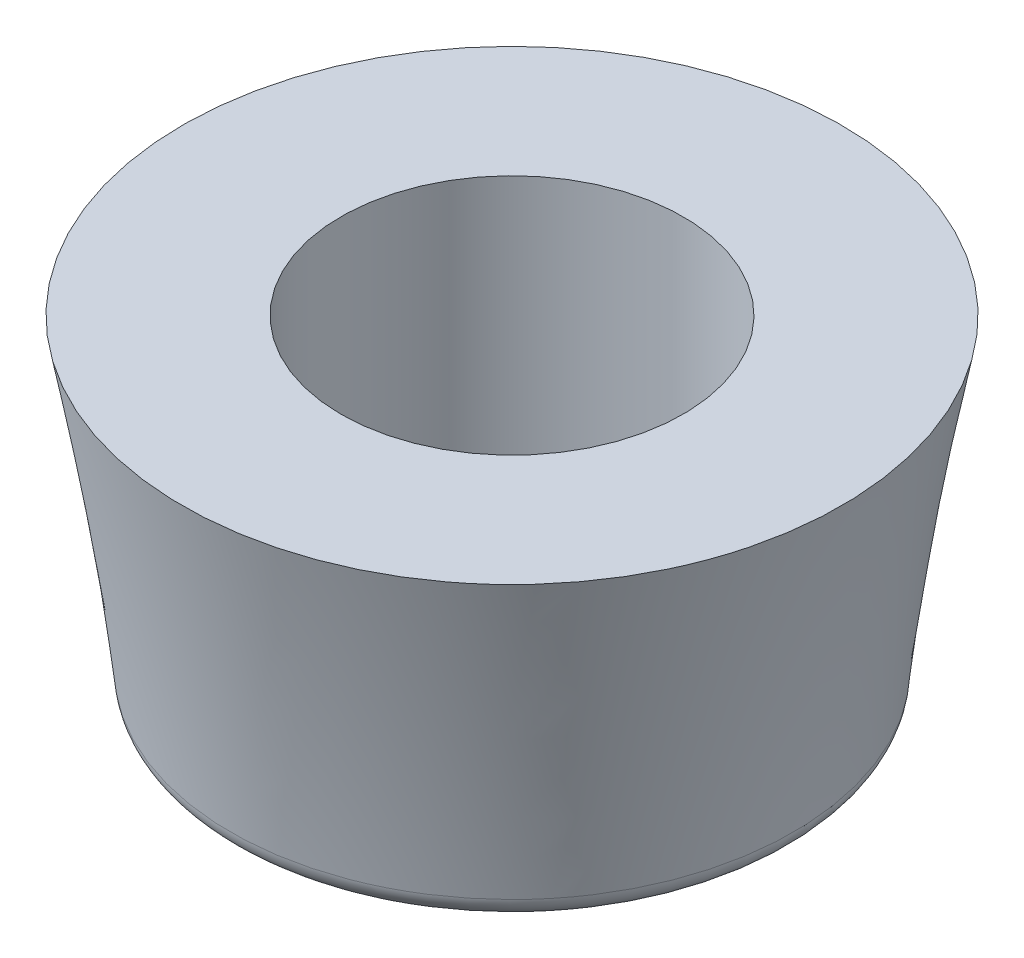
ISO-10303-21;
HEADER;
FILE_DESCRIPTION(('STEP AP214'),'2;1');
FILE_NAME('part.step','',(''),(''),'','','');
FILE_SCHEMA(('AUTOMOTIVE_DESIGN { 1 0 10303 214 1 1 1 1 }'));
ENDSEC;
DATA;
#1=APPLICATION_CONTEXT('core data for automotive mechanical design processes');
#2=APPLICATION_PROTOCOL_DEFINITION('international standard','automotive_design',2000,#1);
#3=PRODUCT_CONTEXT('',#1,'mechanical');
#4=PRODUCT('Part','Part','',(#3));
#5=PRODUCT_RELATED_PRODUCT_CATEGORY('part','',(#4));
#6=PRODUCT_DEFINITION_FORMATION('','',#4);
#7=PRODUCT_DEFINITION_CONTEXT('part definition',#1,'design');
#8=PRODUCT_DEFINITION('design','',#6,#7);
#9=PRODUCT_DEFINITION_SHAPE('','',#8);
#10=(LENGTH_UNIT() NAMED_UNIT(*) SI_UNIT(.MILLI.,.METRE.));
#11=(NAMED_UNIT(*) PLANE_ANGLE_UNIT() SI_UNIT($,.RADIAN.));
#12=(NAMED_UNIT(*) SI_UNIT($,.STERADIAN.) SOLID_ANGLE_UNIT());
#13=UNCERTAINTY_MEASURE_WITH_UNIT(LENGTH_MEASURE(1.E-05),#10,'distance_accuracy_value','');
#14=(GEOMETRIC_REPRESENTATION_CONTEXT(3) GLOBAL_UNCERTAINTY_ASSIGNED_CONTEXT((#13)) GLOBAL_UNIT_ASSIGNED_CONTEXT((#10,
#11,#12)) REPRESENTATION_CONTEXT('',''));
#15=CARTESIAN_POINT('',(0.,0.,0.));
#16=DIRECTION('',(0.,0.,1.));
#17=DIRECTION('',(1.,0.,0.));
#18=AXIS2_PLACEMENT_3D('',#15,#16,#17);
#19=CARTESIAN_POINT('',(0.,0.,0.));
#20=DIRECTION('',(0.,1.,0.));
#21=DIRECTION('',(0.,0.,1.));
#22=AXIS2_PLACEMENT_3D('',#19,#20,#21);
#23=PLANE('',#22);
#24=CARTESIAN_POINT('',(0.,0.,0.));
#25=DIRECTION('',(0.,1.,0.));
#26=DIRECTION('',(0.,0.,1.));
#27=AXIS2_PLACEMENT_3D('',#24,#25,#26);
#28=CIRCLE('',#27,7.25);
#29=CARTESIAN_POINT('',(0.,0.,7.25));
#30=VERTEX_POINT('',#29);
#31=EDGE_CURVE('E44',#30,#30,#28,.T.);
#32=ORIENTED_EDGE('',*,*,#31,.T.);
#33=EDGE_LOOP('',(#32));
#34=FACE_BOUND('',#33,.T.);
#35=CARTESIAN_POINT('',(0.,0.,0.));
#36=DIRECTION('',(0.,1.,0.));
#37=DIRECTION('',(0.,0.,1.));
#38=AXIS2_PLACEMENT_3D('',#35,#36,#37);
#39=CIRCLE('',#38,10.0982468244462);
#40=CARTESIAN_POINT('',(0.,0.,10.0982468244462));
#41=VERTEX_POINT('',#40);
#42=EDGE_CURVE('E48',#41,#41,#39,.F.);
#43=ORIENTED_EDGE('',*,*,#42,.T.);
#44=EDGE_LOOP('',(#43));
#45=FACE_BOUND('',#44,.T.);
#46=ADVANCED_FACE('F36',(#34,#45),#23,.F.);
#47=CARTESIAN_POINT('',(0.,13.,0.));
#48=DIRECTION('',(0.,1.,0.));
#49=DIRECTION('',(0.,0.,1.));
#50=AXIS2_PLACEMENT_3D('',#47,#48,#49);
#51=PLANE('',#50);
#52=CARTESIAN_POINT('',(0.,13.,0.));
#53=DIRECTION('',(0.,1.,0.));
#54=DIRECTION('',(0.,0.,1.));
#55=AXIS2_PLACEMENT_3D('',#52,#53,#54);
#56=CIRCLE('',#55,6.75);
#57=CARTESIAN_POINT('',(0.,13.,6.75));
#58=VERTEX_POINT('',#57);
#59=EDGE_CURVE('E62',#58,#58,#56,.T.);
#60=ORIENTED_EDGE('',*,*,#59,.F.);
#61=EDGE_LOOP('',(#60));
#62=FACE_BOUND('',#61,.T.);
#63=CARTESIAN_POINT('',(0.,13.,0.));
#64=DIRECTION('',(0.,1.,0.));
#65=DIRECTION('',(0.,0.,1.));
#66=AXIS2_PLACEMENT_3D('',#63,#64,#65);
#67=CIRCLE('',#66,13.);
#68=CARTESIAN_POINT('',(-10.8068354385911,13.,-7.22580845326058));
#69=VERTEX_POINT('',#68);
#70=EDGE_CURVE('E57',#69,#69,#67,.T.);
#71=ORIENTED_EDGE('',*,*,#70,.T.);
#72=EDGE_LOOP('',(#71));
#73=FACE_BOUND('',#72,.T.);
#74=ADVANCED_FACE('F68',(#62,#73),#51,.T.);
#75=CARTESIAN_POINT('',(-10.8068354385911,13.,-7.22580845326058));
#76=CARTESIAN_POINT('',(-6.65425982631401,0.,-8.7590425369388));
#77=CARTESIAN_POINT('',(3.64478146793009,13.,-28.8394793304427));
#78=CARTESIAN_POINT('',(10.8638252475636,0.,-22.0675621895668));
#79=CARTESIAN_POINT('',(25.2584523451122,13.,-14.3878624239216));
#80=CARTESIAN_POINT('',(24.1723449001916,0.,-4.54947711568922));
#81=CARTESIAN_POINT('',(10.8068354385911,13.,7.22580845326058));
#82=CARTESIAN_POINT('',(6.65425982631401,0.,8.7590425369388));
#83=CARTESIAN_POINT('',(-3.64478146793008,13.,28.8394793304427));
#84=CARTESIAN_POINT('',(-10.8638252475636,0.,22.0675621895668));
#85=CARTESIAN_POINT('',(-25.2584523451122,13.,14.3878624239216));
#86=CARTESIAN_POINT('',(-24.1723449001916,0.,4.54947711568923));
#87=CARTESIAN_POINT('',(-10.8068354385911,13.,-7.22580845326058));
#88=CARTESIAN_POINT('',(-6.65425982631401,0.,-8.7590425369388));
#89=(BOUNDED_SURFACE() B_SPLINE_SURFACE(3,1,((#75,#76),(#77,#78),(#79,#80),(#81,#82),(#83,#84),
(#85,#86),(#87,#88)),.UNSPECIFIED.,.T.,.F.,.F.) B_SPLINE_SURFACE_WITH_KNOTS((4,3,4),(2,2),(0.,
0.5,1.),(0.,1.),.UNSPECIFIED.) GEOMETRIC_REPRESENTATION_ITEM() RATIONAL_B_SPLINE_SURFACE(((1.,
1.),(0.333333333333333,0.333333333333333),(0.333333333333333,0.333333333333333),(1.,1.),
(0.333333333333333,0.333333333333334),(0.333333333333333,0.333333333333334),(1.,1.))) REPRESENTATION_ITEM('') SURFACE());
#90=CARTESIAN_POINT('',(0.,0.892798140943564,0.));
#91=DIRECTION('',(0.,-1.,0.));
#92=DIRECTION('',(0.,0.,-1.));
#93=AXIS2_PLACEMENT_3D('',#90,#91,#92);
#94=CIRCLE('',#93,11.0924841006609);
#95=CARTESIAN_POINT('',(-6.93944534837313,0.892798140943564,-8.65374495697425));
#96=VERTEX_POINT('',#95);
#97=EDGE_CURVE('E52',#96,#96,#94,.F.);
#98=CARTESIAN_POINT('',(-6.93944534837313,0.892798140943564,-8.65374495697425));
#99=CARTESIAN_POINT('',(-6.9797306618129,1.0189148269754,-8.6388706183939));
#100=CARTESIAN_POINT('',(-7.02001597525267,1.14503151300724,-8.62399627981355));
#101=CARTESIAN_POINT('',(-7.10058660213221,1.39726488507091,-8.59424760265284));
#102=CARTESIAN_POINT('',(-7.14087191557198,1.52338157110275,-8.57937326407249));
#103=CARTESIAN_POINT('',(-7.22144254245152,1.77561494316643,-8.54962458691179));
#104=CARTESIAN_POINT('',(-7.26172785589129,1.90173162919827,-8.53475024833144));
#105=CARTESIAN_POINT('',(-7.34229848277083,2.15396500126194,-8.50500157117074));
#106=CARTESIAN_POINT('',(-7.3825837962106,2.28008168729378,-8.49012723259039));
#107=CARTESIAN_POINT('',(-7.46315442309014,2.53231505935746,-8.46037855542969));
#108=CARTESIAN_POINT('',(-7.50343973652991,2.65843174538929,-8.44550421684934));
#109=CARTESIAN_POINT('',(-7.58401036340945,2.91066511745297,-8.41575553968863));
#110=CARTESIAN_POINT('',(-7.62429567684922,3.03678180348481,-8.40088120110829));
#111=CARTESIAN_POINT('',(-7.70486630372876,3.28901517554848,-8.37113252394758));
#112=CARTESIAN_POINT('',(-7.74515161716854,3.41513186158032,-8.35625818536723));
#113=CARTESIAN_POINT('',(-7.82572224404808,3.667365233644,-8.32650950820653));
#114=CARTESIAN_POINT('',(-7.86600755748784,3.79348191967583,-8.31163516962618));
#115=CARTESIAN_POINT('',(-7.94657818436739,4.04571529173951,-8.28188649246548));
#116=CARTESIAN_POINT('',(-7.98686349780716,4.17183197777135,-8.26701215388513));
#117=CARTESIAN_POINT('',(-8.0674341246867,4.42406534983502,-8.23726347672443));
#118=CARTESIAN_POINT('',(-8.10771943812647,4.55018203586686,-8.22238913814408));
#119=CARTESIAN_POINT('',(-8.18829006500601,4.80241540793054,-8.19264046098337));
#120=CARTESIAN_POINT('',(-8.22857537844578,4.92853209396238,-8.17776612240302));
#121=CARTESIAN_POINT('',(-8.30914600532532,5.18076546602605,-8.14801744524232));
#122=CARTESIAN_POINT('',(-8.34943131876509,5.30688215205789,-8.13314310666197));
#123=CARTESIAN_POINT('',(-8.43000194564463,5.55911552412156,-8.10339442950127));
#124=CARTESIAN_POINT('',(-8.4702872590844,5.6852322101534,-8.08852009092092));
#125=CARTESIAN_POINT('',(-8.55085788596394,5.93746558221708,-8.05877141376022));
#126=CARTESIAN_POINT('',(-8.59114319940371,6.06358226824892,-8.04389707517987));
#127=CARTESIAN_POINT('',(-8.67171382628325,6.31581564031259,-8.01414839801917));
#128=CARTESIAN_POINT('',(-8.71199913972302,6.44193232634443,-7.99927405943882));
#129=CARTESIAN_POINT('',(-8.79256976660256,6.69416569840811,-7.96952538227811));
#130=CARTESIAN_POINT('',(-8.83285508004233,6.82028238443994,-7.95465104369776));
#131=CARTESIAN_POINT('',(-8.91342570692187,7.07251575650362,-7.92490236653706));
#132=CARTESIAN_POINT('',(-8.95371102036164,7.19863244253546,-7.91002802795671));
#133=CARTESIAN_POINT('',(-9.03428164724118,7.45086581459913,-7.88027935079601));
#134=CARTESIAN_POINT('',(-9.07456696068095,7.57698250063097,-7.86540501221566));
#135=CARTESIAN_POINT('',(-9.15513758756049,7.82921587269465,-7.83565633505496));
#136=CARTESIAN_POINT('',(-9.19542290100026,7.95533255872648,-7.82078199647461));
#137=CARTESIAN_POINT('',(-9.2759935278798,8.20756593079016,-7.79103331931391));
#138=CARTESIAN_POINT('',(-9.31627884131957,8.333682616822,-7.77615898073356));
#139=CARTESIAN_POINT('',(-9.39684946819911,8.58591598888567,-7.74641030357285));
#140=CARTESIAN_POINT('',(-9.43713478163888,8.71203267491751,-7.7315359649925));
#141=CARTESIAN_POINT('',(-9.51770540851842,8.96426604698119,-7.7017872878318));
#142=CARTESIAN_POINT('',(-9.55799072195819,9.09038273301302,-7.68691294925145));
#143=CARTESIAN_POINT('',(-9.63856134883773,9.3426161050767,-7.65716427209075));
#144=CARTESIAN_POINT('',(-9.67884666227751,9.46873279110854,-7.6422899335104));
#145=CARTESIAN_POINT('',(-9.75941728915705,9.72096616317221,-7.6125412563497));
#146=CARTESIAN_POINT('',(-9.79970260259682,9.84708284920405,-7.59766691776935));
#147=CARTESIAN_POINT('',(-9.88027322947636,10.0993162212677,-7.56791824060865));
#148=CARTESIAN_POINT('',(-9.92055854291613,10.2254329072996,-7.5530439020283));
#149=CARTESIAN_POINT('',(-10.0011291697957,10.4776662793632,-7.52329522486759));
#150=CARTESIAN_POINT('',(-10.0414144832354,10.6037829653951,-7.50842088628724));
#151=CARTESIAN_POINT('',(-10.121985110115,10.8560163374588,-7.47867220912654));
#152=CARTESIAN_POINT('',(-10.1622704235547,10.9821330234906,-7.46379787054619));
#153=CARTESIAN_POINT('',(-10.2428410504343,11.2343663955543,-7.43404919338549));
#154=CARTESIAN_POINT('',(-10.2831263638741,11.3604830815861,-7.41917485480514));
#155=CARTESIAN_POINT('',(-10.3636969907536,11.6127164536498,-7.38942617764444));
#156=CARTESIAN_POINT('',(-10.4039823041934,11.7388331396816,-7.37455183906409));
#157=CARTESIAN_POINT('',(-10.4845529310729,11.9910665117453,-7.34480316190339));
#158=CARTESIAN_POINT('',(-10.5248382445127,12.1171831977771,-7.32992882332304));
#159=CARTESIAN_POINT('',(-10.6054088713922,12.3694165698408,-7.30018014616233));
#160=CARTESIAN_POINT('',(-10.645694184832,12.4955332558726,-7.28530580758198));
#161=CARTESIAN_POINT('',(-10.7262648117115,12.7477666279363,-7.25555713042128));
#162=CARTESIAN_POINT('',(-10.7665501251513,12.8738833139682,-7.24068279184093));
#163=CARTESIAN_POINT('',(-10.8068354385911,13.,-7.22580845326058));
#164=B_SPLINE_CURVE_WITH_KNOTS('',3,(#98,#99,#100,#101,#102,#103,#104,#105,#106,#107,#108,#109,
#110,#111,#112,#113,#114,#115,#116,#117,#118,#119,#120,#121,#122,#123,#124,#125,#126,#127,#128,
#129,#130,#131,#132,#133,#134,#135,#136,#137,#138,#139,#140,#141,#142,#143,#144,#145,#146,#147,
#148,#149,#150,#151,#152,#153,#154,#155,#156,#157,#158,#159,#160,#161,#162,#163),.UNSPECIFIED.,
.F.,.F.,(4,2,2,2,2,2,2,2,2,2,2,2,2,2,2,2,2,2,2,2,2,2,2,2,2,2,2,2,2,2,2,2,4),(0.,
0.399682546910882,0.799365093821764,1.19904764073265,1.59873018764353,1.99841273455441,
2.39809528146529,2.79777782837617,3.19746037528706,3.59714292219794,3.99682546910882,
4.3965080160197,4.79619056293059,5.19587310984147,5.59555565675235,5.99523820366323,
6.39492075057411,6.794603297485,7.19428584439588,7.59396839130676,7.99365093821764,
8.39333348512853,8.79301603203941,9.19269857895029,9.59238112586117,9.99206367277206,
10.3917462196829,10.7914287665938,11.1911113135047,11.5907938604156,11.9904764073265,
12.3901589542374,12.7898415011482),.UNSPECIFIED.);
#165=EDGE_CURVE('BSEAM78',#96,#69,#164,.T.);
#166=ORIENTED_EDGE('',*,*,#97,.T.);
#167=ORIENTED_EDGE('',*,*,#70,.F.);
#168=ORIENTED_EDGE('',*,*,#165,.T.);
#169=ORIENTED_EDGE('',*,*,#165,.F.);
#170=EDGE_LOOP('',(#166,#168,#167,#169));
#171=FACE_BOUND('',#170,.T.);
#172=ADVANCED_FACE('F78',(#171),#89,.T.);
#173=CARTESIAN_POINT('',(0.,0.999999999999999,0.));
#174=DIRECTION('',(0.,-1.,0.));
#175=DIRECTION('',(0.,0.,-1.));
#176=AXIS2_PLACEMENT_3D('',#173,#174,#175);
#177=TOROIDAL_SURFACE('',#176,10.0982468244462,1.);
#178=ORIENTED_EDGE('',*,*,#42,.F.);
#179=EDGE_LOOP('',(#178));
#180=FACE_BOUND('',#179,.T.);
#181=ORIENTED_EDGE('',*,*,#97,.F.);
#182=EDGE_LOOP('',(#181));
#183=FACE_BOUND('',#182,.T.);
#184=ADVANCED_FACE('F86',(#180,#183),#177,.T.);
#185=CARTESIAN_POINT('',(0.,13.,0.));
#186=DIRECTION('',(0.,1.,0.));
#187=DIRECTION('',(0.,0.,1.));
#188=AXIS2_PLACEMENT_3D('',#185,#186,#187);
#189=CYLINDRICAL_SURFACE('',#188,6.75);
#190=CARTESIAN_POINT('',(0.,0.499999999999999,0.));
#191=DIRECTION('',(0.,1.,0.));
#192=DIRECTION('',(0.,0.,1.));
#193=AXIS2_PLACEMENT_3D('',#190,#191,#192);
#194=CIRCLE('',#193,6.75);
#195=CARTESIAN_POINT('',(0.,0.499999999999999,6.75));
#196=VERTEX_POINT('',#195);
#197=EDGE_CURVE('E11',#196,#196,#194,.F.);
#198=ORIENTED_EDGE('',*,*,#197,.T.);
#199=EDGE_LOOP('',(#198));
#200=FACE_BOUND('',#199,.T.);
#201=ORIENTED_EDGE('',*,*,#59,.T.);
#202=EDGE_LOOP('',(#201));
#203=FACE_BOUND('',#202,.T.);
#204=ADVANCED_FACE('F80',(#200,#203),#189,.F.);
#205=CARTESIAN_POINT('',(0.,0.,0.));
#206=DIRECTION('',(0.,-1.,0.));
#207=DIRECTION('',(0.,0.,-1.));
#208=AXIS2_PLACEMENT_3D('',#205,#206,#207);
#209=CONICAL_SURFACE('',#208,7.25,0.785398163397447);
#210=ORIENTED_EDGE('',*,*,#197,.F.);
#211=EDGE_LOOP('',(#210));
#212=FACE_BOUND('',#211,.T.);
#213=ORIENTED_EDGE('',*,*,#31,.F.);
#214=EDGE_LOOP('',(#213));
#215=FACE_BOUND('',#214,.T.);
#216=ADVANCED_FACE('F39',(#212,#215),#209,.F.);
#217=CLOSED_SHELL('',(#46,#74,#172,#184,#204,#216));
#218=MANIFOLD_SOLID_BREP('B2',#217);
#219=ADVANCED_BREP_SHAPE_REPRESENTATION('',(#18,#218),#14);
#220=SHAPE_DEFINITION_REPRESENTATION(#9,#219);
ENDSEC;
END-ISO-10303-21;
